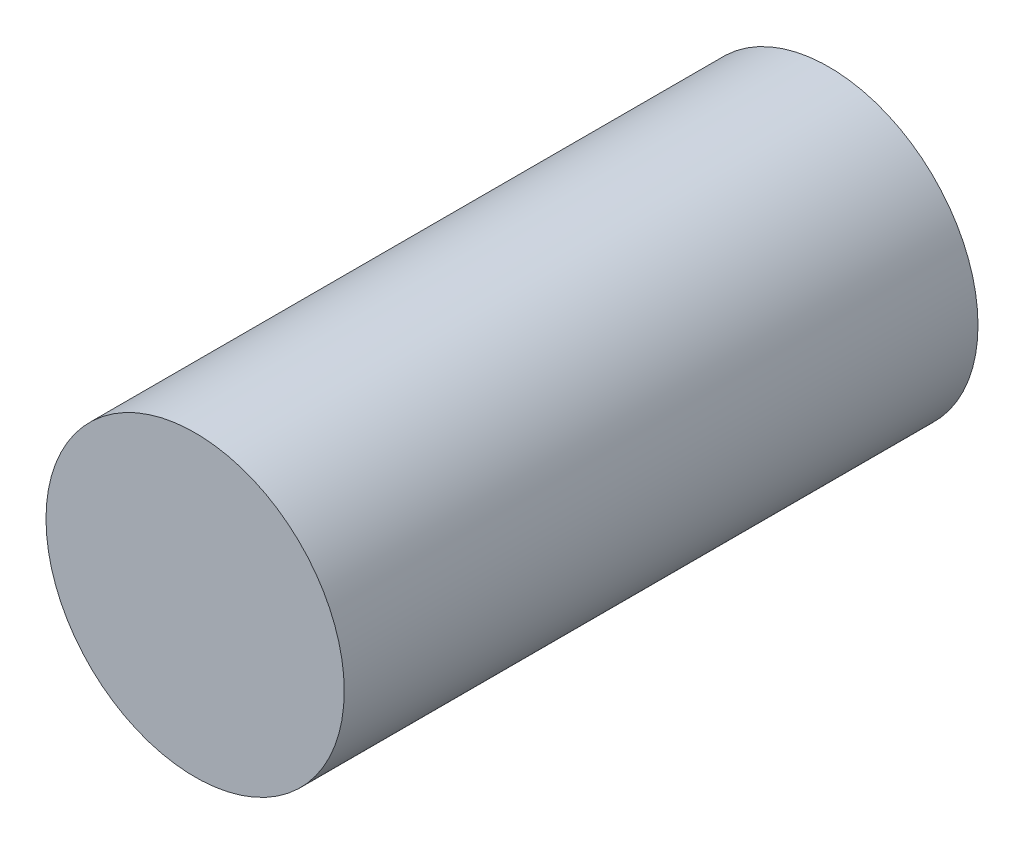
ISO-10303-21;
HEADER;
FILE_DESCRIPTION(('STEP AP214'),'2;1');
FILE_NAME('part.step','',(''),(''),'','','');
FILE_SCHEMA(('AUTOMOTIVE_DESIGN { 1 0 10303 214 1 1 1 1 }'));
ENDSEC;
DATA;
#1=APPLICATION_CONTEXT('core data for automotive mechanical design processes');
#2=APPLICATION_PROTOCOL_DEFINITION('international standard','automotive_design',2000,#1);
#3=PRODUCT_CONTEXT('',#1,'mechanical');
#4=PRODUCT('Part','Part','',(#3));
#5=PRODUCT_RELATED_PRODUCT_CATEGORY('part','',(#4));
#6=PRODUCT_DEFINITION_FORMATION('','',#4);
#7=PRODUCT_DEFINITION_CONTEXT('part definition',#1,'design');
#8=PRODUCT_DEFINITION('design','',#6,#7);
#9=PRODUCT_DEFINITION_SHAPE('','',#8);
#10=(LENGTH_UNIT() NAMED_UNIT(*) SI_UNIT(.MILLI.,.METRE.));
#11=(NAMED_UNIT(*) PLANE_ANGLE_UNIT() SI_UNIT($,.RADIAN.));
#12=(NAMED_UNIT(*) SI_UNIT($,.STERADIAN.) SOLID_ANGLE_UNIT());
#13=UNCERTAINTY_MEASURE_WITH_UNIT(LENGTH_MEASURE(1.E-05),#10,'distance_accuracy_value','');
#14=(GEOMETRIC_REPRESENTATION_CONTEXT(3) GLOBAL_UNCERTAINTY_ASSIGNED_CONTEXT((#13)) GLOBAL_UNIT_ASSIGNED_CONTEXT((#10,
#11,#12)) REPRESENTATION_CONTEXT('',''));
#15=CARTESIAN_POINT('',(0.,0.,0.));
#16=DIRECTION('',(0.,0.,1.));
#17=DIRECTION('',(1.,0.,0.));
#18=AXIS2_PLACEMENT_3D('',#15,#16,#17);
#19=CARTESIAN_POINT('',(0.,0.,17.));
#20=DIRECTION('',(0.,0.,-1.));
#21=DIRECTION('',(-1.,0.,0.));
#22=AXIS2_PLACEMENT_3D('',#19,#20,#21);
#23=CYLINDRICAL_SURFACE('',#22,4.);
#24=CARTESIAN_POINT('',(0.,0.,17.));
#25=DIRECTION('',(0.,0.,1.));
#26=DIRECTION('',(1.,0.,0.));
#27=AXIS2_PLACEMENT_3D('',#24,#25,#26);
#28=CIRCLE('',#27,4.);
#29=CARTESIAN_POINT('',(4.,0.,17.));
#30=VERTEX_POINT('',#29);
#31=EDGE_CURVE('E10',#30,#30,#28,.T.);
#32=ORIENTED_EDGE('',*,*,#31,.F.);
#33=EDGE_LOOP('',(#32));
#34=FACE_BOUND('',#33,.T.);
#35=CARTESIAN_POINT('',(0.,0.,0.));
#36=DIRECTION('',(0.,0.,1.));
#37=DIRECTION('',(1.,0.,0.));
#38=AXIS2_PLACEMENT_3D('',#35,#36,#37);
#39=CIRCLE('',#38,4.);
#40=CARTESIAN_POINT('',(4.,0.,0.));
#41=VERTEX_POINT('',#40);
#42=EDGE_CURVE('E34',#41,#41,#39,.T.);
#43=ORIENTED_EDGE('',*,*,#42,.T.);
#44=EDGE_LOOP('',(#43));
#45=FACE_BOUND('',#44,.T.);
#46=ADVANCED_FACE('F31',(#34,#45),#23,.T.);
#47=CARTESIAN_POINT('',(0.,0.,17.));
#48=DIRECTION('',(0.,0.,1.));
#49=DIRECTION('',(1.,0.,0.));
#50=AXIS2_PLACEMENT_3D('',#47,#48,#49);
#51=PLANE('',#50);
#52=ORIENTED_EDGE('',*,*,#31,.T.);
#53=EDGE_LOOP('',(#52));
#54=FACE_BOUND('',#53,.T.);
#55=ADVANCED_FACE('F46',(#54),#51,.T.);
#56=CARTESIAN_POINT('',(0.,0.,0.));
#57=DIRECTION('',(0.,0.,1.));
#58=DIRECTION('',(1.,0.,0.));
#59=AXIS2_PLACEMENT_3D('',#56,#57,#58);
#60=PLANE('',#59);
#61=ORIENTED_EDGE('',*,*,#42,.F.);
#62=EDGE_LOOP('',(#61));
#63=FACE_BOUND('',#62,.T.);
#64=ADVANCED_FACE('F44',(#63),#60,.F.);
#65=CLOSED_SHELL('',(#46,#55,#64));
#66=MANIFOLD_SOLID_BREP('B2',#65);
#67=ADVANCED_BREP_SHAPE_REPRESENTATION('',(#18,#66),#14);
#68=SHAPE_DEFINITION_REPRESENTATION(#9,#67);
ENDSEC;
END-ISO-10303-21;
